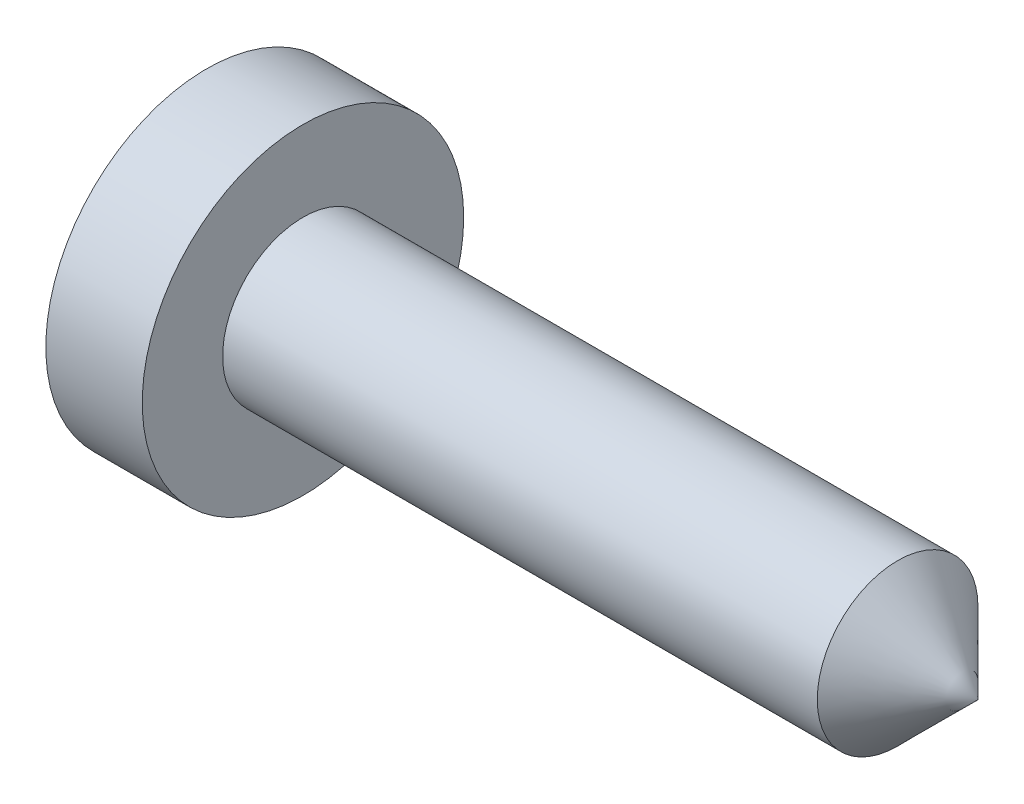
ISO-10303-21;
HEADER;
FILE_DESCRIPTION(('STEP AP214'),'2;1');
FILE_NAME('part.step','',(''),(''),'','','');
FILE_SCHEMA(('AUTOMOTIVE_DESIGN { 1 0 10303 214 1 1 1 1 }'));
ENDSEC;
DATA;
#1=APPLICATION_CONTEXT('core data for automotive mechanical design processes');
#2=APPLICATION_PROTOCOL_DEFINITION('international standard','automotive_design',2000,#1);
#3=PRODUCT_CONTEXT('',#1,'mechanical');
#4=PRODUCT('Part','Part','',(#3));
#5=PRODUCT_RELATED_PRODUCT_CATEGORY('part','',(#4));
#6=PRODUCT_DEFINITION_FORMATION('','',#4);
#7=PRODUCT_DEFINITION_CONTEXT('part definition',#1,'design');
#8=PRODUCT_DEFINITION('design','',#6,#7);
#9=PRODUCT_DEFINITION_SHAPE('','',#8);
#10=(LENGTH_UNIT() NAMED_UNIT(*) SI_UNIT(.MILLI.,.METRE.));
#11=(NAMED_UNIT(*) PLANE_ANGLE_UNIT() SI_UNIT($,.RADIAN.));
#12=(NAMED_UNIT(*) SI_UNIT($,.STERADIAN.) SOLID_ANGLE_UNIT());
#13=UNCERTAINTY_MEASURE_WITH_UNIT(LENGTH_MEASURE(1.E-05),#10,'distance_accuracy_value','');
#14=(GEOMETRIC_REPRESENTATION_CONTEXT(3) GLOBAL_UNCERTAINTY_ASSIGNED_CONTEXT((#13)) GLOBAL_UNIT_ASSIGNED_CONTEXT((#10,
#11,#12)) REPRESENTATION_CONTEXT('',''));
#15=CARTESIAN_POINT('',(0.,0.,0.));
#16=DIRECTION('',(0.,0.,1.));
#17=DIRECTION('',(1.,0.,0.));
#18=AXIS2_PLACEMENT_3D('',#15,#16,#17);
#19=CARTESIAN_POINT('',(3.,0.,0.));
#20=DIRECTION('',(-1.,0.,0.));
#21=DIRECTION('',(0.,0.,1.));
#22=AXIS2_PLACEMENT_3D('',#19,#20,#21);
#23=CYLINDRICAL_SURFACE('',#22,5.);
#24=CARTESIAN_POINT('',(3.,0.,0.));
#25=DIRECTION('',(1.,0.,0.));
#26=DIRECTION('',(0.,0.,-1.));
#27=AXIS2_PLACEMENT_3D('',#24,#25,#26);
#28=CIRCLE('',#27,5.);
#29=CARTESIAN_POINT('',(3.,0.,-5.));
#30=VERTEX_POINT('',#29);
#31=EDGE_CURVE('E46',#30,#30,#28,.T.);
#32=ORIENTED_EDGE('',*,*,#31,.F.);
#33=EDGE_LOOP('',(#32));
#34=FACE_BOUND('',#33,.T.);
#35=CARTESIAN_POINT('',(0.,0.,0.));
#36=DIRECTION('',(1.,0.,0.));
#37=DIRECTION('',(0.,0.,-1.));
#38=AXIS2_PLACEMENT_3D('',#35,#36,#37);
#39=CIRCLE('',#38,5.);
#40=CARTESIAN_POINT('',(0.,0.,-5.));
#41=VERTEX_POINT('',#40);
#42=EDGE_CURVE('E42',#41,#41,#39,.T.);
#43=ORIENTED_EDGE('',*,*,#42,.T.);
#44=EDGE_LOOP('',(#43));
#45=FACE_BOUND('',#44,.T.);
#46=ADVANCED_FACE('F39',(#34,#45),#23,.T.);
#47=CARTESIAN_POINT('',(3.,0.,0.));
#48=DIRECTION('',(1.,0.,0.));
#49=DIRECTION('',(0.,0.,-1.));
#50=AXIS2_PLACEMENT_3D('',#47,#48,#49);
#51=PLANE('',#50);
#52=CARTESIAN_POINT('',(3.,0.,0.));
#53=DIRECTION('',(1.,0.,0.));
#54=DIRECTION('',(0.,0.,-1.));
#55=AXIS2_PLACEMENT_3D('',#52,#53,#54);
#56=CIRCLE('',#55,2.5);
#57=CARTESIAN_POINT('',(3.,0.,-2.5));
#58=VERTEX_POINT('',#57);
#59=EDGE_CURVE('E11',#58,#58,#56,.T.);
#60=ORIENTED_EDGE('',*,*,#59,.F.);
#61=EDGE_LOOP('',(#60));
#62=FACE_BOUND('',#61,.T.);
#63=ORIENTED_EDGE('',*,*,#31,.T.);
#64=EDGE_LOOP('',(#63));
#65=FACE_BOUND('',#64,.T.);
#66=ADVANCED_FACE('F63',(#62,#65),#51,.T.);
#67=CARTESIAN_POINT('',(0.,0.,0.));
#68=DIRECTION('',(1.,0.,0.));
#69=DIRECTION('',(0.,0.,-1.));
#70=AXIS2_PLACEMENT_3D('',#67,#68,#69);
#71=PLANE('',#70);
#72=ORIENTED_EDGE('',*,*,#42,.F.);
#73=EDGE_LOOP('',(#72));
#74=FACE_BOUND('',#73,.T.);
#75=ADVANCED_FACE('F58',(#74),#71,.F.);
#76=CARTESIAN_POINT('',(21.5,0.,0.));
#77=DIRECTION('',(-1.,0.,0.));
#78=DIRECTION('',(0.,0.,1.));
#79=AXIS2_PLACEMENT_3D('',#76,#77,#78);
#80=CYLINDRICAL_SURFACE('',#79,2.5);
#81=CARTESIAN_POINT('',(21.5,0.,0.));
#82=DIRECTION('',(1.,0.,0.));
#83=DIRECTION('',(0.,0.,-1.));
#84=AXIS2_PLACEMENT_3D('',#81,#82,#83);
#85=CIRCLE('',#84,2.5);
#86=CARTESIAN_POINT('',(21.5,0.,-2.5));
#87=VERTEX_POINT('',#86);
#88=EDGE_CURVE('E76',#87,#87,#85,.T.);
#89=ORIENTED_EDGE('',*,*,#88,.F.);
#90=EDGE_LOOP('',(#89));
#91=FACE_BOUND('',#90,.T.);
#92=ORIENTED_EDGE('',*,*,#59,.T.);
#93=EDGE_LOOP('',(#92));
#94=FACE_BOUND('',#93,.T.);
#95=ADVANCED_FACE('F52',(#91,#94),#80,.T.);
#96=CARTESIAN_POINT('',(24.,0.,0.));
#97=DIRECTION('',(-1.,0.,0.));
#98=DIRECTION('',(0.,0.,1.));
#99=AXIS2_PLACEMENT_3D('',#96,#97,#98);
#100=CONICAL_SURFACE('',#99,0.,0.785398163397449);
#101=ORIENTED_EDGE('',*,*,#88,.T.);
#102=EDGE_LOOP('',(#101));
#103=FACE_BOUND('',#102,.T.);
#104=CARTESIAN_POINT('',(24.,0.,0.));
#105=VERTEX_POINT('',#104);
#106=VERTEX_LOOP('',#105);
#107=FACE_BOUND('',#106,.T.);
#108=ADVANCED_FACE('F50',(#103,#107),#100,.T.);
#109=CLOSED_SHELL('',(#46,#66,#75,#95,#108));
#110=MANIFOLD_SOLID_BREP('B2',#109);
#111=ADVANCED_BREP_SHAPE_REPRESENTATION('',(#18,#110),#14);
#112=SHAPE_DEFINITION_REPRESENTATION(#9,#111);
ENDSEC;
END-ISO-10303-21;
